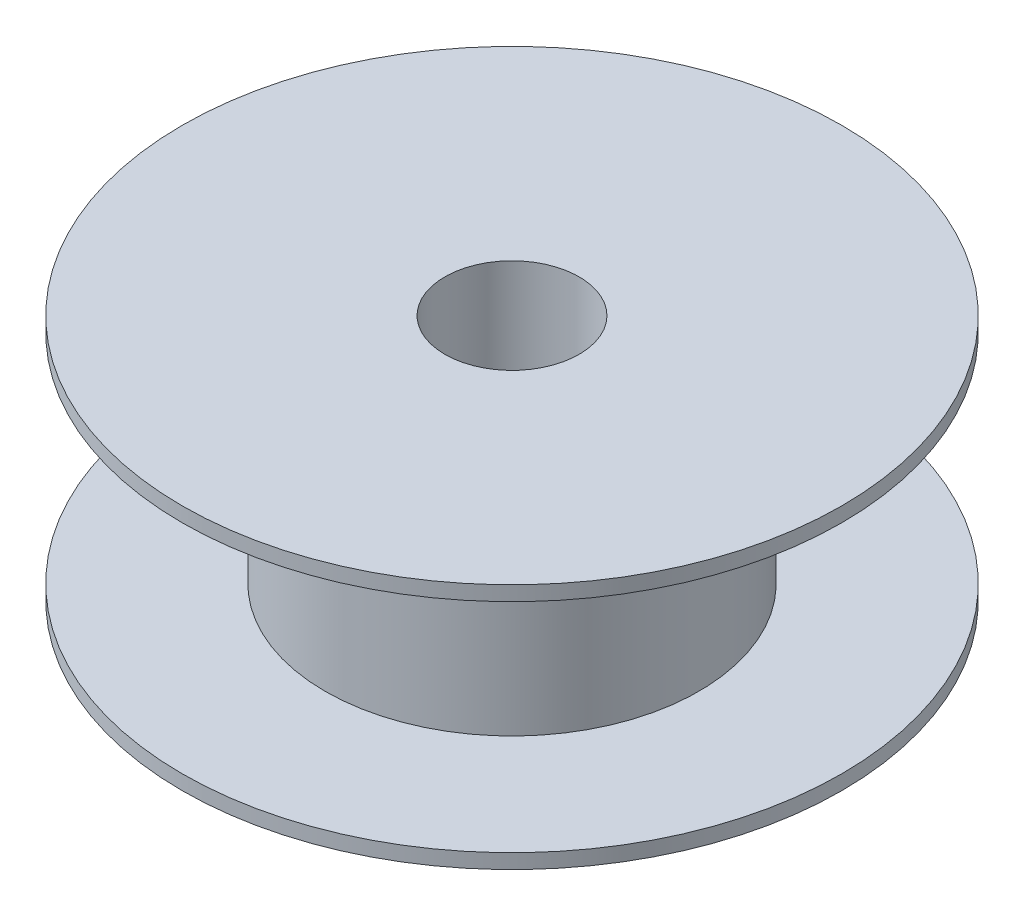
ISO-10303-21;
HEADER;
FILE_DESCRIPTION(('STEP AP214'),'2;1');
FILE_NAME('part.step','',(''),(''),'','','');
FILE_SCHEMA(('AUTOMOTIVE_DESIGN { 1 0 10303 214 1 1 1 1 }'));
ENDSEC;
DATA;
#1=APPLICATION_CONTEXT('core data for automotive mechanical design processes');
#2=APPLICATION_PROTOCOL_DEFINITION('international standard','automotive_design',2000,#1);
#3=PRODUCT_CONTEXT('',#1,'mechanical');
#4=PRODUCT('Part','Part','',(#3));
#5=PRODUCT_RELATED_PRODUCT_CATEGORY('part','',(#4));
#6=PRODUCT_DEFINITION_FORMATION('','',#4);
#7=PRODUCT_DEFINITION_CONTEXT('part definition',#1,'design');
#8=PRODUCT_DEFINITION('design','',#6,#7);
#9=PRODUCT_DEFINITION_SHAPE('','',#8);
#10=(LENGTH_UNIT() NAMED_UNIT(*) SI_UNIT(.MILLI.,.METRE.));
#11=(NAMED_UNIT(*) PLANE_ANGLE_UNIT() SI_UNIT($,.RADIAN.));
#12=(NAMED_UNIT(*) SI_UNIT($,.STERADIAN.) SOLID_ANGLE_UNIT());
#13=UNCERTAINTY_MEASURE_WITH_UNIT(LENGTH_MEASURE(1.E-05),#10,'distance_accuracy_value','');
#14=(GEOMETRIC_REPRESENTATION_CONTEXT(3) GLOBAL_UNCERTAINTY_ASSIGNED_CONTEXT((#13)) GLOBAL_UNIT_ASSIGNED_CONTEXT((#10,
#11,#12)) REPRESENTATION_CONTEXT('',''));
#15=CARTESIAN_POINT('',(0.,0.,0.));
#16=DIRECTION('',(0.,0.,1.));
#17=DIRECTION('',(1.,0.,0.));
#18=AXIS2_PLACEMENT_3D('',#15,#16,#17);
#19=CARTESIAN_POINT('',(0.,0.,0.));
#20=DIRECTION('',(0.,-1.,0.));
#21=DIRECTION('',(0.,0.,-1.));
#22=AXIS2_PLACEMENT_3D('',#19,#20,#21);
#23=CYLINDRICAL_SURFACE('',#22,135.);
#24=CARTESIAN_POINT('',(0.,101.,0.));
#25=DIRECTION('',(0.,-1.,0.));
#26=DIRECTION('',(0.,0.,-1.));
#27=AXIS2_PLACEMENT_3D('',#24,#25,#26);
#28=CIRCLE('',#27,135.);
#29=CARTESIAN_POINT('',(0.,101.,-135.));
#30=VERTEX_POINT('',#29);
#31=EDGE_CURVE('E55',#30,#30,#28,.T.);
#32=ORIENTED_EDGE('',*,*,#31,.T.);
#33=EDGE_LOOP('',(#32));
#34=FACE_BOUND('',#33,.T.);
#35=CARTESIAN_POINT('',(0.,95.,0.));
#36=DIRECTION('',(0.,-1.,0.));
#37=DIRECTION('',(0.,0.,-1.));
#38=AXIS2_PLACEMENT_3D('',#35,#36,#37);
#39=CIRCLE('',#38,135.);
#40=CARTESIAN_POINT('',(0.,95.,-135.));
#41=VERTEX_POINT('',#40);
#42=EDGE_CURVE('E10',#41,#41,#39,.T.);
#43=ORIENTED_EDGE('',*,*,#42,.F.);
#44=EDGE_LOOP('',(#43));
#45=FACE_BOUND('',#44,.T.);
#46=ADVANCED_FACE('F33',(#34,#45),#23,.T.);
#47=CARTESIAN_POINT('',(0.,95.,0.));
#48=DIRECTION('',(0.,-1.,0.));
#49=DIRECTION('',(0.,0.,-1.));
#50=AXIS2_PLACEMENT_3D('',#47,#48,#49);
#51=PLANE('',#50);
#52=ORIENTED_EDGE('',*,*,#42,.T.);
#53=EDGE_LOOP('',(#52));
#54=FACE_BOUND('',#53,.T.);
#55=CARTESIAN_POINT('',(0.,95.,0.));
#56=DIRECTION('',(0.,-1.,0.));
#57=DIRECTION('',(0.,0.,-1.));
#58=AXIS2_PLACEMENT_3D('',#55,#56,#57);
#59=CIRCLE('',#58,76.5);
#60=CARTESIAN_POINT('',(0.,95.,-76.5));
#61=VERTEX_POINT('',#60);
#62=EDGE_CURVE('E39',#61,#61,#59,.T.);
#63=ORIENTED_EDGE('',*,*,#62,.F.);
#64=EDGE_LOOP('',(#63));
#65=FACE_BOUND('',#64,.T.);
#66=ADVANCED_FACE('F76',(#54,#65),#51,.T.);
#67=CARTESIAN_POINT('',(0.,0.,0.));
#68=DIRECTION('',(0.,-1.,0.));
#69=DIRECTION('',(0.,0.,-1.));
#70=AXIS2_PLACEMENT_3D('',#67,#68,#69);
#71=CYLINDRICAL_SURFACE('',#70,76.5);
#72=ORIENTED_EDGE('',*,*,#62,.T.);
#73=EDGE_LOOP('',(#72));
#74=FACE_BOUND('',#73,.T.);
#75=CARTESIAN_POINT('',(0.,5.99999999999998,0.));
#76=DIRECTION('',(0.,-1.,0.));
#77=DIRECTION('',(0.,0.,-1.));
#78=AXIS2_PLACEMENT_3D('',#75,#76,#77);
#79=CIRCLE('',#78,76.5);
#80=CARTESIAN_POINT('',(0.,5.99999999999998,-76.5));
#81=VERTEX_POINT('',#80);
#82=EDGE_CURVE('E43',#81,#81,#79,.T.);
#83=ORIENTED_EDGE('',*,*,#82,.F.);
#84=EDGE_LOOP('',(#83));
#85=FACE_BOUND('',#84,.T.);
#86=ADVANCED_FACE('F80',(#74,#85),#71,.T.);
#87=CARTESIAN_POINT('',(0.,5.99999999999998,0.));
#88=DIRECTION('',(0.,-1.,0.));
#89=DIRECTION('',(0.,0.,-1.));
#90=AXIS2_PLACEMENT_3D('',#87,#88,#89);
#91=PLANE('',#90);
#92=CARTESIAN_POINT('',(0.,5.99999999999998,0.));
#93=DIRECTION('',(0.,-1.,0.));
#94=DIRECTION('',(0.,0.,-1.));
#95=AXIS2_PLACEMENT_3D('',#92,#93,#94);
#96=CIRCLE('',#95,135.);
#97=CARTESIAN_POINT('',(0.,5.99999999999998,-135.));
#98=VERTEX_POINT('',#97);
#99=EDGE_CURVE('E47',#98,#98,#96,.T.);
#100=ORIENTED_EDGE('',*,*,#99,.F.);
#101=EDGE_LOOP('',(#100));
#102=FACE_BOUND('',#101,.T.);
#103=ORIENTED_EDGE('',*,*,#82,.T.);
#104=EDGE_LOOP('',(#103));
#105=FACE_BOUND('',#104,.T.);
#106=ADVANCED_FACE('F84',(#102,#105),#91,.F.);
#107=CARTESIAN_POINT('',(0.,0.,0.));
#108=DIRECTION('',(0.,-1.,0.));
#109=DIRECTION('',(0.,0.,-1.));
#110=AXIS2_PLACEMENT_3D('',#107,#108,#109);
#111=CYLINDRICAL_SURFACE('',#110,135.);
#112=ORIENTED_EDGE('',*,*,#99,.T.);
#113=EDGE_LOOP('',(#112));
#114=FACE_BOUND('',#113,.T.);
#115=CARTESIAN_POINT('',(0.,0.,0.));
#116=DIRECTION('',(0.,-1.,0.));
#117=DIRECTION('',(0.,0.,-1.));
#118=AXIS2_PLACEMENT_3D('',#115,#116,#117);
#119=CIRCLE('',#118,135.);
#120=CARTESIAN_POINT('',(0.,0.,-135.));
#121=VERTEX_POINT('',#120);
#122=EDGE_CURVE('E52',#121,#121,#119,.T.);
#123=ORIENTED_EDGE('',*,*,#122,.F.);
#124=EDGE_LOOP('',(#123));
#125=FACE_BOUND('',#124,.T.);
#126=ADVANCED_FACE('F90',(#114,#125),#111,.T.);
#127=CARTESIAN_POINT('',(0.,0.,0.));
#128=DIRECTION('',(0.,-1.,0.));
#129=DIRECTION('',(0.,0.,-1.));
#130=AXIS2_PLACEMENT_3D('',#127,#128,#129);
#131=PLANE('',#130);
#132=CARTESIAN_POINT('',(0.,0.,0.));
#133=DIRECTION('',(0.,-1.,0.));
#134=DIRECTION('',(0.,0.,-1.));
#135=AXIS2_PLACEMENT_3D('',#132,#133,#134);
#136=CIRCLE('',#135,27.5);
#137=CARTESIAN_POINT('',(0.,0.,-27.5));
#138=VERTEX_POINT('',#137);
#139=EDGE_CURVE('E58',#138,#138,#136,.T.);
#140=ORIENTED_EDGE('',*,*,#139,.F.);
#141=EDGE_LOOP('',(#140));
#142=FACE_BOUND('',#141,.T.);
#143=ORIENTED_EDGE('',*,*,#122,.T.);
#144=EDGE_LOOP('',(#143));
#145=FACE_BOUND('',#144,.T.);
#146=ADVANCED_FACE('F70',(#142,#145),#131,.T.);
#147=CARTESIAN_POINT('',(0.,101.,0.));
#148=DIRECTION('',(0.,-1.,0.));
#149=DIRECTION('',(0.,0.,-1.));
#150=AXIS2_PLACEMENT_3D('',#147,#148,#149);
#151=PLANE('',#150);
#152=CARTESIAN_POINT('',(0.,101.,0.));
#153=DIRECTION('',(0.,1.,0.));
#154=DIRECTION('',(0.,0.,1.));
#155=AXIS2_PLACEMENT_3D('',#152,#153,#154);
#156=CIRCLE('',#155,27.5);
#157=CARTESIAN_POINT('',(0.,101.,27.5));
#158=VERTEX_POINT('',#157);
#159=EDGE_CURVE('E61',#158,#158,#156,.T.);
#160=ORIENTED_EDGE('',*,*,#159,.F.);
#161=EDGE_LOOP('',(#160));
#162=FACE_BOUND('',#161,.T.);
#163=ORIENTED_EDGE('',*,*,#31,.F.);
#164=EDGE_LOOP('',(#163));
#165=FACE_BOUND('',#164,.T.);
#166=ADVANCED_FACE('F67',(#162,#165),#151,.F.);
#167=CARTESIAN_POINT('',(0.,-159.,0.));
#168=DIRECTION('',(0.,1.,0.));
#169=DIRECTION('',(0.,0.,1.));
#170=AXIS2_PLACEMENT_3D('',#167,#168,#169);
#171=CYLINDRICAL_SURFACE('',#170,27.5);
#172=ORIENTED_EDGE('',*,*,#139,.T.);
#173=EDGE_LOOP('',(#172));
#174=FACE_BOUND('',#173,.T.);
#175=ORIENTED_EDGE('',*,*,#159,.T.);
#176=EDGE_LOOP('',(#175));
#177=FACE_BOUND('',#176,.T.);
#178=ADVANCED_FACE('F65',(#174,#177),#171,.F.);
#179=CLOSED_SHELL('',(#46,#66,#86,#106,#126,#146,#166,#178));
#180=MANIFOLD_SOLID_BREP('B2',#179);
#181=ADVANCED_BREP_SHAPE_REPRESENTATION('',(#18,#180),#14);
#182=SHAPE_DEFINITION_REPRESENTATION(#9,#181);
ENDSEC;
END-ISO-10303-21;
